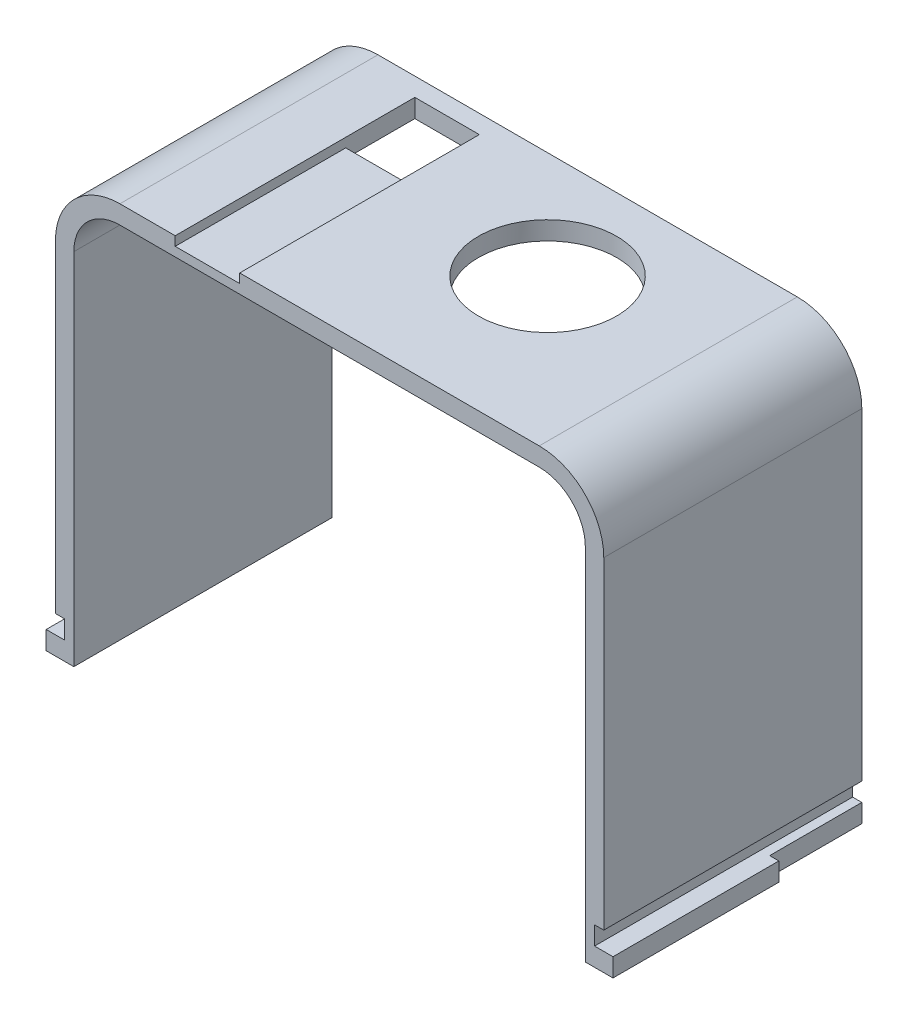
ISO-10303-21;
HEADER;
FILE_DESCRIPTION(('STEP AP214'),'2;1');
FILE_NAME('part.step','',(''),(''),'','','');
FILE_SCHEMA(('AUTOMOTIVE_DESIGN { 1 0 10303 214 1 1 1 1 }'));
ENDSEC;
DATA;
#1=APPLICATION_CONTEXT('core data for automotive mechanical design processes');
#2=APPLICATION_PROTOCOL_DEFINITION('international standard','automotive_design',2000,#1);
#3=PRODUCT_CONTEXT('',#1,'mechanical');
#4=PRODUCT('Part','Part','',(#3));
#5=PRODUCT_RELATED_PRODUCT_CATEGORY('part','',(#4));
#6=PRODUCT_DEFINITION_FORMATION('','',#4);
#7=PRODUCT_DEFINITION_CONTEXT('part definition',#1,'design');
#8=PRODUCT_DEFINITION('design','',#6,#7);
#9=PRODUCT_DEFINITION_SHAPE('','',#8);
#10=(LENGTH_UNIT() NAMED_UNIT(*) SI_UNIT(.MILLI.,.METRE.));
#11=(NAMED_UNIT(*) PLANE_ANGLE_UNIT() SI_UNIT($,.RADIAN.));
#12=(NAMED_UNIT(*) SI_UNIT($,.STERADIAN.) SOLID_ANGLE_UNIT());
#13=UNCERTAINTY_MEASURE_WITH_UNIT(LENGTH_MEASURE(1.E-05),#10,'distance_accuracy_value','');
#14=(GEOMETRIC_REPRESENTATION_CONTEXT(3) GLOBAL_UNCERTAINTY_ASSIGNED_CONTEXT((#13)) GLOBAL_UNIT_ASSIGNED_CONTEXT((#10,
#11,#12)) REPRESENTATION_CONTEXT('',''));
#15=CARTESIAN_POINT('',(0.,0.,0.));
#16=DIRECTION('',(0.,0.,1.));
#17=DIRECTION('',(1.,0.,0.));
#18=AXIS2_PLACEMENT_3D('',#15,#16,#17);
#19=CARTESIAN_POINT('',(-19.5890410958904,38.,9.5));
#20=DIRECTION('',(0.,0.,1.));
#21=DIRECTION('',(1.,0.,0.));
#22=AXIS2_PLACEMENT_3D('',#19,#20,#21);
#23=PLANE('',#22);
#24=DIRECTION('',(-1.,0.,0.));
#25=VECTOR('',#24,1.);
#26=CARTESIAN_POINT('',(-19.5890410958904,39.,9.5));
#27=LINE('',#26,#25);
#28=CARTESIAN_POINT('',(-12.5890410958904,39.,9.5));
#29=VERTEX_POINT('',#28);
#30=CARTESIAN_POINT('',(-19.5890410958904,39.,9.5));
#31=VERTEX_POINT('',#30);
#32=EDGE_CURVE('E228',#29,#31,#27,.T.);
#33=ORIENTED_EDGE('',*,*,#32,.F.);
#34=DIRECTION('',(0.,1.,0.));
#35=VECTOR('',#34,1.);
#36=CARTESIAN_POINT('',(-12.5890410958904,38.,9.5));
#37=LINE('',#36,#35);
#38=CARTESIAN_POINT('',(-12.5890410958904,38.,9.5));
#39=VERTEX_POINT('',#38);
#40=EDGE_CURVE('E266',#39,#29,#37,.T.);
#41=ORIENTED_EDGE('',*,*,#40,.F.);
#42=DIRECTION('',(1.,0.,0.));
#43=VECTOR('',#42,1.);
#44=CARTESIAN_POINT('',(-19.5890410958904,38.,9.5));
#45=LINE('',#44,#43);
#46=CARTESIAN_POINT('',(-19.5890410958904,38.,9.5));
#47=VERTEX_POINT('',#46);
#48=EDGE_CURVE('E246',#47,#39,#45,.T.);
#49=ORIENTED_EDGE('',*,*,#48,.F.);
#50=DIRECTION('',(0.,1.,0.));
#51=VECTOR('',#50,1.);
#52=CARTESIAN_POINT('',(-19.5890410958904,38.,9.5));
#53=LINE('',#52,#51);
#54=EDGE_CURVE('E254',#47,#31,#53,.T.);
#55=ORIENTED_EDGE('',*,*,#54,.T.);
#56=EDGE_LOOP('',(#33,#41,#49,#55));
#57=FACE_BOUND('',#56,.T.);
#58=ADVANCED_FACE('F32',(#57),#23,.F.);
#59=CARTESIAN_POINT('',(-30.5890410958904,0.,28.));
#60=DIRECTION('',(-1.,0.,0.));
#61=DIRECTION('',(0.,0.,1.));
#62=AXIS2_PLACEMENT_3D('',#59,#60,#61);
#63=PLANE('',#62);
#64=DIRECTION('',(0.,1.,0.));
#65=VECTOR('',#64,1.);
#66=CARTESIAN_POINT('',(-30.5890410958904,0.,0.));
#67=LINE('',#66,#65);
#68=CARTESIAN_POINT('',(-30.5890410958904,-6.00000000000001,0.));
#69=VERTEX_POINT('',#68);
#70=CARTESIAN_POINT('',(-30.5890410958904,33.,0.));
#71=VERTEX_POINT('',#70);
#72=EDGE_CURVE('E356',#69,#71,#67,.T.);
#73=ORIENTED_EDGE('',*,*,#72,.T.);
#74=DIRECTION('',(0.,0.,-1.));
#75=VECTOR('',#74,1.);
#76=CARTESIAN_POINT('',(-30.5890410958904,33.,28.));
#77=LINE('',#76,#75);
#78=CARTESIAN_POINT('',(-30.5890410958904,33.,28.));
#79=VERTEX_POINT('',#78);
#80=EDGE_CURVE('E11',#79,#71,#77,.T.);
#81=ORIENTED_EDGE('',*,*,#80,.F.);
#82=DIRECTION('',(0.,1.,0.));
#83=VECTOR('',#82,1.);
#84=CARTESIAN_POINT('',(-30.5890410958904,0.,28.));
#85=LINE('',#84,#83);
#86=CARTESIAN_POINT('',(-30.5890410958904,-6.00000000000001,28.));
#87=VERTEX_POINT('',#86);
#88=EDGE_CURVE('E358',#87,#79,#85,.T.);
#89=ORIENTED_EDGE('',*,*,#88,.F.);
#90=DIRECTION('',(0.,0.,-1.));
#91=VECTOR('',#90,1.);
#92=CARTESIAN_POINT('',(-30.5890410958904,-6.00000000000001,28.));
#93=LINE('',#92,#91);
#94=EDGE_CURVE('E386',#87,#69,#93,.T.);
#95=ORIENTED_EDGE('',*,*,#94,.T.);
#96=EDGE_LOOP('',(#73,#81,#89,#95));
#97=FACE_BOUND('',#96,.T.);
#98=ADVANCED_FACE('F34',(#97),#63,.F.);
#99=CARTESIAN_POINT('',(-25.5890410958904,33.,28.));
#100=DIRECTION('',(0.,0.,-1.));
#101=DIRECTION('',(-1.,0.,0.));
#102=AXIS2_PLACEMENT_3D('',#99,#100,#101);
#103=CYLINDRICAL_SURFACE('',#102,5.);
#104=CARTESIAN_POINT('',(-25.5890410958904,33.,0.));
#105=DIRECTION('',(0.,0.,-1.));
#106=DIRECTION('',(-1.,0.,0.));
#107=AXIS2_PLACEMENT_3D('',#104,#105,#106);
#108=CIRCLE('',#107,5.);
#109=CARTESIAN_POINT('',(-25.5890410958904,38.,0.));
#110=VERTEX_POINT('',#109);
#111=EDGE_CURVE('E388',#71,#110,#108,.T.);
#112=ORIENTED_EDGE('',*,*,#111,.T.);
#113=DIRECTION('',(0.,0.,-1.));
#114=VECTOR('',#113,1.);
#115=CARTESIAN_POINT('',(-25.5890410958904,38.,28.));
#116=LINE('',#115,#114);
#117=CARTESIAN_POINT('',(-25.5890410958904,38.,28.));
#118=VERTEX_POINT('',#117);
#119=EDGE_CURVE('E40',#118,#110,#116,.T.);
#120=ORIENTED_EDGE('',*,*,#119,.F.);
#121=CARTESIAN_POINT('',(-25.5890410958904,33.,28.));
#122=DIRECTION('',(0.,0.,-1.));
#123=DIRECTION('',(-1.,0.,0.));
#124=AXIS2_PLACEMENT_3D('',#121,#122,#123);
#125=CIRCLE('',#124,5.);
#126=EDGE_CURVE('E360',#79,#118,#125,.T.);
#127=ORIENTED_EDGE('',*,*,#126,.F.);
#128=ORIENTED_EDGE('',*,*,#80,.T.);
#129=EDGE_LOOP('',(#112,#120,#127,#128));
#130=FACE_BOUND('',#129,.T.);
#131=ADVANCED_FACE('F463',(#130),#103,.F.);
#132=CARTESIAN_POINT('',(-25.5890410958904,38.,28.));
#133=DIRECTION('',(0.,1.,0.));
#134=DIRECTION('',(-1.,0.,0.));
#135=AXIS2_PLACEMENT_3D('',#132,#133,#134);
#136=PLANE('',#135);
#137=DIRECTION('',(-1.,0.,0.));
#138=VECTOR('',#137,1.);
#139=CARTESIAN_POINT('',(-19.5890410958904,38.,2.));
#140=LINE('',#139,#138);
#141=CARTESIAN_POINT('',(-12.5890410958904,38.,2.));
#142=VERTEX_POINT('',#141);
#143=CARTESIAN_POINT('',(-19.5890410958904,38.,2.));
#144=VERTEX_POINT('',#143);
#145=EDGE_CURVE('E251',#142,#144,#140,.T.);
#146=ORIENTED_EDGE('',*,*,#145,.T.);
#147=DIRECTION('',(0.,0.,1.));
#148=VECTOR('',#147,1.);
#149=CARTESIAN_POINT('',(-19.5890410958904,38.,9.5));
#150=LINE('',#149,#148);
#151=EDGE_CURVE('E243',#144,#47,#150,.T.);
#152=ORIENTED_EDGE('',*,*,#151,.T.);
#153=ORIENTED_EDGE('',*,*,#48,.T.);
#154=DIRECTION('',(0.,0.,-1.));
#155=VECTOR('',#154,1.);
#156=CARTESIAN_POINT('',(-12.5890410958904,38.,9.5));
#157=LINE('',#156,#155);
#158=EDGE_CURVE('E55',#39,#142,#157,.T.);
#159=ORIENTED_EDGE('',*,*,#158,.T.);
#160=EDGE_LOOP('',(#146,#152,#153,#159));
#161=FACE_BOUND('',#160,.T.);
#162=CARTESIAN_POINT('',(4.41095890410959,38.,11.6));
#163=DIRECTION('',(0.,1.,0.));
#164=DIRECTION('',(-1.,0.,0.));
#165=AXIS2_PLACEMENT_3D('',#162,#163,#164);
#166=CIRCLE('',#165,7.5);
#167=CARTESIAN_POINT('',(-3.08904109589041,38.,11.6));
#168=VERTEX_POINT('',#167);
#169=EDGE_CURVE('E288',#168,#168,#166,.T.);
#170=ORIENTED_EDGE('',*,*,#169,.T.);
#171=EDGE_LOOP('',(#170));
#172=FACE_BOUND('',#171,.T.);
#173=DIRECTION('',(1.,0.,0.));
#174=VECTOR('',#173,1.);
#175=CARTESIAN_POINT('',(-25.5890410958904,38.,0.));
#176=LINE('',#175,#174);
#177=CARTESIAN_POINT('',(19.9109589041096,38.,0.));
#178=VERTEX_POINT('',#177);
#179=EDGE_CURVE('E390',#110,#178,#176,.T.);
#180=ORIENTED_EDGE('',*,*,#179,.T.);
#181=DIRECTION('',(0.,0.,-1.));
#182=VECTOR('',#181,1.);
#183=CARTESIAN_POINT('',(19.9109589041096,38.,28.));
#184=LINE('',#183,#182);
#185=CARTESIAN_POINT('',(19.9109589041096,38.,28.));
#186=VERTEX_POINT('',#185);
#187=EDGE_CURVE('E434',#186,#178,#184,.T.);
#188=ORIENTED_EDGE('',*,*,#187,.F.);
#189=DIRECTION('',(1.,0.,0.));
#190=VECTOR('',#189,1.);
#191=CARTESIAN_POINT('',(-25.5890410958904,38.,28.));
#192=LINE('',#191,#190);
#193=EDGE_CURVE('E363',#118,#186,#192,.T.);
#194=ORIENTED_EDGE('',*,*,#193,.F.);
#195=ORIENTED_EDGE('',*,*,#119,.T.);
#196=EDGE_LOOP('',(#180,#188,#194,#195));
#197=FACE_BOUND('',#196,.T.);
#198=ADVANCED_FACE('F441',(#161,#172,#197),#136,.F.);
#199=CARTESIAN_POINT('',(19.9109589041096,33.,28.));
#200=DIRECTION('',(0.,0.,-1.));
#201=DIRECTION('',(-1.,0.,0.));
#202=AXIS2_PLACEMENT_3D('',#199,#200,#201);
#203=CYLINDRICAL_SURFACE('',#202,5.);
#204=CARTESIAN_POINT('',(19.9109589041096,33.,0.));
#205=DIRECTION('',(0.,0.,-1.));
#206=DIRECTION('',(-1.,0.,0.));
#207=AXIS2_PLACEMENT_3D('',#204,#205,#206);
#208=CIRCLE('',#207,5.);
#209=CARTESIAN_POINT('',(24.9109589041096,33.,0.));
#210=VERTEX_POINT('',#209);
#211=EDGE_CURVE('E392',#178,#210,#208,.T.);
#212=ORIENTED_EDGE('',*,*,#211,.T.);
#213=DIRECTION('',(0.,0.,-1.));
#214=VECTOR('',#213,1.);
#215=CARTESIAN_POINT('',(24.9109589041096,33.,28.));
#216=LINE('',#215,#214);
#217=CARTESIAN_POINT('',(24.9109589041096,33.,28.));
#218=VERTEX_POINT('',#217);
#219=EDGE_CURVE('E431',#218,#210,#216,.T.);
#220=ORIENTED_EDGE('',*,*,#219,.F.);
#221=CARTESIAN_POINT('',(19.9109589041096,33.,28.));
#222=DIRECTION('',(0.,0.,-1.));
#223=DIRECTION('',(-1.,0.,0.));
#224=AXIS2_PLACEMENT_3D('',#221,#222,#223);
#225=CIRCLE('',#224,5.);
#226=EDGE_CURVE('E365',#186,#218,#225,.T.);
#227=ORIENTED_EDGE('',*,*,#226,.F.);
#228=ORIENTED_EDGE('',*,*,#187,.T.);
#229=EDGE_LOOP('',(#212,#220,#227,#228));
#230=FACE_BOUND('',#229,.T.);
#231=ADVANCED_FACE('F453',(#230),#203,.F.);
#232=CARTESIAN_POINT('',(24.9109589041096,0.,28.));
#233=DIRECTION('',(1.,0.,0.));
#234=DIRECTION('',(0.,0.,-1.));
#235=AXIS2_PLACEMENT_3D('',#232,#233,#234);
#236=PLANE('',#235);
#237=DIRECTION('',(0.,-1.,0.));
#238=VECTOR('',#237,1.);
#239=CARTESIAN_POINT('',(24.9109589041096,0.,0.));
#240=LINE('',#239,#238);
#241=CARTESIAN_POINT('',(24.9109589041096,-6.00000000000001,0.));
#242=VERTEX_POINT('',#241);
#243=EDGE_CURVE('E395',#210,#242,#240,.T.);
#244=ORIENTED_EDGE('',*,*,#243,.T.);
#245=DIRECTION('',(0.,0.,-1.));
#246=VECTOR('',#245,1.);
#247=CARTESIAN_POINT('',(24.9109589041096,-6.00000000000001,28.));
#248=LINE('',#247,#246);
#249=CARTESIAN_POINT('',(24.9109589041096,-6.00000000000001,28.));
#250=VERTEX_POINT('',#249);
#251=EDGE_CURVE('E428',#250,#242,#248,.T.);
#252=ORIENTED_EDGE('',*,*,#251,.F.);
#253=DIRECTION('',(0.,-1.,0.));
#254=VECTOR('',#253,1.);
#255=CARTESIAN_POINT('',(24.9109589041096,33.,28.));
#256=LINE('',#255,#254);
#257=EDGE_CURVE('E367',#218,#250,#256,.T.);
#258=ORIENTED_EDGE('',*,*,#257,.F.);
#259=ORIENTED_EDGE('',*,*,#219,.T.);
#260=EDGE_LOOP('',(#244,#252,#258,#259));
#261=FACE_BOUND('',#260,.T.);
#262=ADVANCED_FACE('F457',(#261),#236,.F.);
#263=CARTESIAN_POINT('',(24.9109589041096,-6.00000000000001,28.));
#264=DIRECTION('',(0.,1.,0.));
#265=DIRECTION('',(0.,0.,1.));
#266=AXIS2_PLACEMENT_3D('',#263,#264,#265);
#267=PLANE('',#266);
#268=DIRECTION('',(1.,0.,0.));
#269=VECTOR('',#268,1.);
#270=CARTESIAN_POINT('',(24.9109589041096,-6.00000000000001,0.));
#271=LINE('',#270,#269);
#272=CARTESIAN_POINT('',(26.9109589041096,-6.00000000000001,0.));
#273=VERTEX_POINT('',#272);
#274=EDGE_CURVE('E397',#242,#273,#271,.T.);
#275=ORIENTED_EDGE('',*,*,#274,.T.);
#276=DIRECTION('',(0.,0.,-1.));
#277=VECTOR('',#276,1.);
#278=CARTESIAN_POINT('',(26.9109589041096,-6.00000000000001,10.));
#279=LINE('',#278,#277);
#280=CARTESIAN_POINT('',(26.9109589041096,-6.00000000000001,10.));
#281=VERTEX_POINT('',#280);
#282=EDGE_CURVE('E281',#281,#273,#279,.T.);
#283=ORIENTED_EDGE('',*,*,#282,.F.);
#284=DIRECTION('',(-1.,0.,0.));
#285=VECTOR('',#284,1.);
#286=CARTESIAN_POINT('',(26.9109589041096,-6.00000000000001,10.));
#287=LINE('',#286,#285);
#288=CARTESIAN_POINT('',(27.9109589041096,-6.00000000000001,10.));
#289=VERTEX_POINT('',#288);
#290=EDGE_CURVE('E276',#289,#281,#287,.T.);
#291=ORIENTED_EDGE('',*,*,#290,.F.);
#292=DIRECTION('',(0.,0.,1.));
#293=VECTOR('',#292,1.);
#294=CARTESIAN_POINT('',(27.9109589041096,-6.00000000000001,0.));
#295=LINE('',#294,#293);
#296=CARTESIAN_POINT('',(27.9109589041096,-6.00000000000001,28.));
#297=VERTEX_POINT('',#296);
#298=EDGE_CURVE('E332',#289,#297,#295,.T.);
#299=ORIENTED_EDGE('',*,*,#298,.T.);
#300=DIRECTION('',(1.,0.,0.));
#301=VECTOR('',#300,1.);
#302=CARTESIAN_POINT('',(24.9109589041096,-6.00000000000001,28.));
#303=LINE('',#302,#301);
#304=EDGE_CURVE('E369',#250,#297,#303,.T.);
#305=ORIENTED_EDGE('',*,*,#304,.F.);
#306=ORIENTED_EDGE('',*,*,#251,.T.);
#307=EDGE_LOOP('',(#275,#283,#291,#299,#305,#306));
#308=FACE_BOUND('',#307,.T.);
#309=ADVANCED_FACE('F524',(#308),#267,.F.);
#310=CARTESIAN_POINT('',(26.9109589041096,0.,28.));
#311=DIRECTION('',(-1.,0.,0.));
#312=DIRECTION('',(0.,-1.,0.));
#313=AXIS2_PLACEMENT_3D('',#310,#311,#312);
#314=PLANE('',#313);
#315=DIRECTION('',(0.,1.,0.));
#316=VECTOR('',#315,1.);
#317=CARTESIAN_POINT('',(26.9109589041096,0.,28.));
#318=LINE('',#317,#316);
#319=CARTESIAN_POINT('',(26.9109589041096,-2.,28.));
#320=VERTEX_POINT('',#319);
#321=CARTESIAN_POINT('',(26.9109589041096,33.,28.));
#322=VERTEX_POINT('',#321);
#323=EDGE_CURVE('E372',#320,#322,#318,.T.);
#324=ORIENTED_EDGE('',*,*,#323,.F.);
#325=DIRECTION('',(0.,0.,1.));
#326=VECTOR('',#325,1.);
#327=CARTESIAN_POINT('',(26.9109589041096,-2.,0.));
#328=LINE('',#327,#326);
#329=CARTESIAN_POINT('',(26.9109589041096,-2.,0.));
#330=VERTEX_POINT('',#329);
#331=EDGE_CURVE('E320',#330,#320,#328,.T.);
#332=ORIENTED_EDGE('',*,*,#331,.F.);
#333=DIRECTION('',(0.,1.,0.));
#334=VECTOR('',#333,1.);
#335=CARTESIAN_POINT('',(26.9109589041096,0.,0.));
#336=LINE('',#335,#334);
#337=CARTESIAN_POINT('',(26.9109589041096,33.,0.));
#338=VERTEX_POINT('',#337);
#339=EDGE_CURVE('E400',#330,#338,#336,.T.);
#340=ORIENTED_EDGE('',*,*,#339,.T.);
#341=DIRECTION('',(0.,0.,-1.));
#342=VECTOR('',#341,1.);
#343=CARTESIAN_POINT('',(26.9109589041096,33.,28.));
#344=LINE('',#343,#342);
#345=EDGE_CURVE('E425',#322,#338,#344,.T.);
#346=ORIENTED_EDGE('',*,*,#345,.F.);
#347=EDGE_LOOP('',(#324,#332,#340,#346));
#348=FACE_BOUND('',#347,.T.);
#349=ADVANCED_FACE('F505',(#348),#314,.F.);
#350=CARTESIAN_POINT('',(19.9109589041096,33.,28.));
#351=DIRECTION('',(0.,0.,-1.));
#352=DIRECTION('',(-1.,0.,0.));
#353=AXIS2_PLACEMENT_3D('',#350,#351,#352);
#354=CYLINDRICAL_SURFACE('',#353,7.);
#355=CARTESIAN_POINT('',(19.9109589041096,33.,0.));
#356=DIRECTION('',(0.,0.,1.));
#357=DIRECTION('',(1.,0.,0.));
#358=AXIS2_PLACEMENT_3D('',#355,#356,#357);
#359=CIRCLE('',#358,7.);
#360=CARTESIAN_POINT('',(19.9109589041096,40.,0.));
#361=VERTEX_POINT('',#360);
#362=EDGE_CURVE('E402',#338,#361,#359,.T.);
#363=ORIENTED_EDGE('',*,*,#362,.T.);
#364=DIRECTION('',(0.,0.,-1.));
#365=VECTOR('',#364,1.);
#366=CARTESIAN_POINT('',(19.9109589041096,40.,28.));
#367=LINE('',#366,#365);
#368=CARTESIAN_POINT('',(19.9109589041096,40.,28.));
#369=VERTEX_POINT('',#368);
#370=EDGE_CURVE('E422',#369,#361,#367,.T.);
#371=ORIENTED_EDGE('',*,*,#370,.F.);
#372=CARTESIAN_POINT('',(19.9109589041096,33.,28.));
#373=DIRECTION('',(0.,0.,1.));
#374=DIRECTION('',(1.,0.,0.));
#375=AXIS2_PLACEMENT_3D('',#372,#373,#374);
#376=CIRCLE('',#375,7.);
#377=EDGE_CURVE('E374',#322,#369,#376,.T.);
#378=ORIENTED_EDGE('',*,*,#377,.F.);
#379=ORIENTED_EDGE('',*,*,#345,.T.);
#380=EDGE_LOOP('',(#363,#371,#378,#379));
#381=FACE_BOUND('',#380,.T.);
#382=ADVANCED_FACE('F501',(#381),#354,.T.);
#383=CARTESIAN_POINT('',(19.9109589041096,40.,28.));
#384=DIRECTION('',(0.,-1.,0.));
#385=DIRECTION('',(0.,0.,-1.));
#386=AXIS2_PLACEMENT_3D('',#383,#384,#385);
#387=PLANE('',#386);
#388=DIRECTION('',(-1.,0.,0.));
#389=VECTOR('',#388,1.);
#390=CARTESIAN_POINT('',(19.9109589041096,40.,28.));
#391=LINE('',#390,#389);
#392=CARTESIAN_POINT('',(-19.5890410958904,40.,28.));
#393=VERTEX_POINT('',#392);
#394=CARTESIAN_POINT('',(-25.5890410958904,40.,28.));
#395=VERTEX_POINT('',#394);
#396=EDGE_CURVE('E376',#393,#395,#391,.T.);
#397=ORIENTED_EDGE('',*,*,#396,.F.);
#398=DIRECTION('',(0.,0.,1.));
#399=VECTOR('',#398,1.);
#400=CARTESIAN_POINT('',(-19.5890410958904,40.,9.5));
#401=LINE('',#400,#399);
#402=CARTESIAN_POINT('',(-19.5890410958904,40.,2.));
#403=VERTEX_POINT('',#402);
#404=EDGE_CURVE('E223',#403,#393,#401,.T.);
#405=ORIENTED_EDGE('',*,*,#404,.F.);
#406=DIRECTION('',(-1.,0.,0.));
#407=VECTOR('',#406,1.);
#408=CARTESIAN_POINT('',(-19.5890410958904,40.,2.));
#409=LINE('',#408,#407);
#410=CARTESIAN_POINT('',(-12.5890410958904,40.,2.));
#411=VERTEX_POINT('',#410);
#412=EDGE_CURVE('E247',#411,#403,#409,.T.);
#413=ORIENTED_EDGE('',*,*,#412,.F.);
#414=DIRECTION('',(0.,0.,-1.));
#415=VECTOR('',#414,1.);
#416=CARTESIAN_POINT('',(-12.5890410958904,40.,9.5));
#417=LINE('',#416,#415);
#418=CARTESIAN_POINT('',(-12.5890410958904,40.,28.));
#419=VERTEX_POINT('',#418);
#420=EDGE_CURVE('E256',#419,#411,#417,.T.);
#421=ORIENTED_EDGE('',*,*,#420,.F.);
#422=EDGE_CURVE('E377',#369,#419,#391,.T.);
#423=ORIENTED_EDGE('',*,*,#422,.F.);
#424=ORIENTED_EDGE('',*,*,#370,.T.);
#425=DIRECTION('',(-1.,0.,0.));
#426=VECTOR('',#425,1.);
#427=CARTESIAN_POINT('',(19.9109589041096,40.,0.));
#428=LINE('',#427,#426);
#429=CARTESIAN_POINT('',(-25.5890410958904,40.,0.));
#430=VERTEX_POINT('',#429);
#431=EDGE_CURVE('E404',#361,#430,#428,.T.);
#432=ORIENTED_EDGE('',*,*,#431,.T.);
#433=DIRECTION('',(0.,0.,-1.));
#434=VECTOR('',#433,1.);
#435=CARTESIAN_POINT('',(-25.5890410958904,40.,28.));
#436=LINE('',#435,#434);
#437=EDGE_CURVE('E419',#395,#430,#436,.T.);
#438=ORIENTED_EDGE('',*,*,#437,.F.);
#439=EDGE_LOOP('',(#397,#405,#413,#421,#423,#424,#432,#438));
#440=FACE_BOUND('',#439,.T.);
#441=CARTESIAN_POINT('',(4.41095890410959,40.,11.6));
#442=DIRECTION('',(0.,1.,0.));
#443=DIRECTION('',(0.,0.,1.));
#444=AXIS2_PLACEMENT_3D('',#441,#442,#443);
#445=CIRCLE('',#444,7.5);
#446=CARTESIAN_POINT('',(4.41095890410959,40.,19.1));
#447=VERTEX_POINT('',#446);
#448=EDGE_CURVE('E283',#447,#447,#445,.T.);
#449=ORIENTED_EDGE('',*,*,#448,.F.);
#450=EDGE_LOOP('',(#449));
#451=FACE_BOUND('',#450,.T.);
#452=ADVANCED_FACE('F495',(#440,#451),#387,.F.);
#453=CARTESIAN_POINT('',(-25.5890410958904,33.,28.));
#454=DIRECTION('',(0.,0.,-1.));
#455=DIRECTION('',(-1.,0.,0.));
#456=AXIS2_PLACEMENT_3D('',#453,#454,#455);
#457=CYLINDRICAL_SURFACE('',#456,7.);
#458=CARTESIAN_POINT('',(-25.5890410958904,33.,0.));
#459=DIRECTION('',(0.,0.,1.));
#460=DIRECTION('',(1.,0.,0.));
#461=AXIS2_PLACEMENT_3D('',#458,#459,#460);
#462=CIRCLE('',#461,7.);
#463=CARTESIAN_POINT('',(-32.5890410958904,32.9999999999999,0.));
#464=VERTEX_POINT('',#463);
#465=EDGE_CURVE('E406',#430,#464,#462,.T.);
#466=ORIENTED_EDGE('',*,*,#465,.T.);
#467=DIRECTION('',(0.,0.,-1.));
#468=VECTOR('',#467,1.);
#469=CARTESIAN_POINT('',(-32.5890410958904,32.9999999999999,28.));
#470=LINE('',#469,#468);
#471=CARTESIAN_POINT('',(-32.5890410958904,32.9999999999999,28.));
#472=VERTEX_POINT('',#471);
#473=EDGE_CURVE('E416',#472,#464,#470,.T.);
#474=ORIENTED_EDGE('',*,*,#473,.F.);
#475=CARTESIAN_POINT('',(-25.5890410958904,33.,28.));
#476=DIRECTION('',(0.,0.,1.));
#477=DIRECTION('',(1.,0.,0.));
#478=AXIS2_PLACEMENT_3D('',#475,#476,#477);
#479=CIRCLE('',#478,7.);
#480=EDGE_CURVE('E379',#395,#472,#479,.T.);
#481=ORIENTED_EDGE('',*,*,#480,.F.);
#482=ORIENTED_EDGE('',*,*,#437,.T.);
#483=EDGE_LOOP('',(#466,#474,#481,#482));
#484=FACE_BOUND('',#483,.T.);
#485=ADVANCED_FACE('F489',(#484),#457,.T.);
#486=CARTESIAN_POINT('',(-32.5890410958904,0.,28.));
#487=DIRECTION('',(1.,0.,0.));
#488=DIRECTION('',(0.,0.,-1.));
#489=AXIS2_PLACEMENT_3D('',#486,#487,#488);
#490=PLANE('',#489);
#491=DIRECTION('',(0.,-1.,0.));
#492=VECTOR('',#491,1.);
#493=CARTESIAN_POINT('',(-32.5890410958904,0.,0.));
#494=LINE('',#493,#492);
#495=CARTESIAN_POINT('',(-32.5890410958904,-2.,0.));
#496=VERTEX_POINT('',#495);
#497=EDGE_CURVE('E409',#464,#496,#494,.T.);
#498=ORIENTED_EDGE('',*,*,#497,.T.);
#499=DIRECTION('',(0.,0.,1.));
#500=VECTOR('',#499,1.);
#501=CARTESIAN_POINT('',(-32.5890410958904,-2.,0.));
#502=LINE('',#501,#500);
#503=CARTESIAN_POINT('',(-32.5890410958904,-2.,28.));
#504=VERTEX_POINT('',#503);
#505=EDGE_CURVE('E305',#496,#504,#502,.T.);
#506=ORIENTED_EDGE('',*,*,#505,.T.);
#507=DIRECTION('',(0.,-1.,0.));
#508=VECTOR('',#507,1.);
#509=CARTESIAN_POINT('',(-32.5890410958904,32.9999999999999,28.));
#510=LINE('',#509,#508);
#511=EDGE_CURVE('E381',#472,#504,#510,.T.);
#512=ORIENTED_EDGE('',*,*,#511,.F.);
#513=ORIENTED_EDGE('',*,*,#473,.T.);
#514=EDGE_LOOP('',(#498,#506,#512,#513));
#515=FACE_BOUND('',#514,.T.);
#516=ADVANCED_FACE('F484',(#515),#490,.F.);
#517=CARTESIAN_POINT('',(-32.5890410958904,-6.00000000000001,28.));
#518=DIRECTION('',(0.,1.,0.));
#519=DIRECTION('',(0.,0.,1.));
#520=AXIS2_PLACEMENT_3D('',#517,#518,#519);
#521=PLANE('',#520);
#522=DIRECTION('',(1.,0.,0.));
#523=VECTOR('',#522,1.);
#524=CARTESIAN_POINT('',(-32.5890410958904,-6.00000000000001,0.));
#525=LINE('',#524,#523);
#526=CARTESIAN_POINT('',(-33.5890410958904,-6.,0.));
#527=VERTEX_POINT('',#526);
#528=EDGE_CURVE('E361',#527,#69,#525,.T.);
#529=ORIENTED_EDGE('',*,*,#528,.T.);
#530=ORIENTED_EDGE('',*,*,#94,.F.);
#531=DIRECTION('',(1.,0.,0.));
#532=VECTOR('',#531,1.);
#533=CARTESIAN_POINT('',(-32.5890410958904,-6.00000000000001,28.));
#534=LINE('',#533,#532);
#535=CARTESIAN_POINT('',(-33.5890410958904,-6.,28.));
#536=VERTEX_POINT('',#535);
#537=EDGE_CURVE('E384',#536,#87,#534,.T.);
#538=ORIENTED_EDGE('',*,*,#537,.F.);
#539=DIRECTION('',(0.,0.,1.));
#540=VECTOR('',#539,1.);
#541=CARTESIAN_POINT('',(-33.5890410958904,-6.,0.));
#542=LINE('',#541,#540);
#543=EDGE_CURVE('E353',#527,#536,#542,.T.);
#544=ORIENTED_EDGE('',*,*,#543,.F.);
#545=EDGE_LOOP('',(#529,#530,#538,#544));
#546=FACE_BOUND('',#545,.T.);
#547=ADVANCED_FACE('F469',(#546),#521,.F.);
#548=CARTESIAN_POINT('',(-25.5890410958904,33.,28.));
#549=DIRECTION('',(0.,0.,1.));
#550=DIRECTION('',(1.,0.,0.));
#551=AXIS2_PLACEMENT_3D('',#548,#549,#550);
#552=PLANE('',#551);
#553=DIRECTION('',(0.,1.,0.));
#554=VECTOR('',#553,1.);
#555=CARTESIAN_POINT('',(-19.5890410958904,39.,28.));
#556=LINE('',#555,#554);
#557=CARTESIAN_POINT('',(-19.5890410958904,39.,28.));
#558=VERTEX_POINT('',#557);
#559=EDGE_CURVE('E218',#558,#393,#556,.T.);
#560=ORIENTED_EDGE('',*,*,#559,.T.);
#561=ORIENTED_EDGE('',*,*,#396,.T.);
#562=ORIENTED_EDGE('',*,*,#480,.T.);
#563=ORIENTED_EDGE('',*,*,#511,.T.);
#564=DIRECTION('',(-1.,0.,0.));
#565=VECTOR('',#564,1.);
#566=CARTESIAN_POINT('',(-32.5890410958904,-2.,28.));
#567=LINE('',#566,#565);
#568=CARTESIAN_POINT('',(-31.5890410958904,-2.,28.));
#569=VERTEX_POINT('',#568);
#570=EDGE_CURVE('E296',#569,#504,#567,.T.);
#571=ORIENTED_EDGE('',*,*,#570,.F.);
#572=DIRECTION('',(0.,1.,0.));
#573=VECTOR('',#572,1.);
#574=CARTESIAN_POINT('',(-31.5890410958904,-4.,28.));
#575=LINE('',#574,#573);
#576=CARTESIAN_POINT('',(-31.5890410958904,-4.,28.));
#577=VERTEX_POINT('',#576);
#578=EDGE_CURVE('E300',#577,#569,#575,.T.);
#579=ORIENTED_EDGE('',*,*,#578,.F.);
#580=DIRECTION('',(-1.,0.,0.));
#581=VECTOR('',#580,1.);
#582=CARTESIAN_POINT('',(-32.5890410958904,-4.,28.));
#583=LINE('',#582,#581);
#584=CARTESIAN_POINT('',(-33.5890410958904,-4.,28.));
#585=VERTEX_POINT('',#584);
#586=EDGE_CURVE('E339',#577,#585,#583,.T.);
#587=ORIENTED_EDGE('',*,*,#586,.T.);
#588=DIRECTION('',(0.,-1.,0.));
#589=VECTOR('',#588,1.);
#590=CARTESIAN_POINT('',(-33.5890410958904,-6.,28.));
#591=LINE('',#590,#589);
#592=EDGE_CURVE('E345',#585,#536,#591,.T.);
#593=ORIENTED_EDGE('',*,*,#592,.T.);
#594=ORIENTED_EDGE('',*,*,#537,.T.);
#595=ORIENTED_EDGE('',*,*,#88,.T.);
#596=ORIENTED_EDGE('',*,*,#126,.T.);
#597=ORIENTED_EDGE('',*,*,#193,.T.);
#598=ORIENTED_EDGE('',*,*,#226,.T.);
#599=ORIENTED_EDGE('',*,*,#257,.T.);
#600=ORIENTED_EDGE('',*,*,#304,.T.);
#601=DIRECTION('',(0.,1.,0.));
#602=VECTOR('',#601,1.);
#603=CARTESIAN_POINT('',(27.9109589041096,-6.00000000000001,28.));
#604=LINE('',#603,#602);
#605=CARTESIAN_POINT('',(27.9109589041096,-4.,28.));
#606=VERTEX_POINT('',#605);
#607=EDGE_CURVE('E308',#297,#606,#604,.T.);
#608=ORIENTED_EDGE('',*,*,#607,.T.);
#609=DIRECTION('',(-1.,0.,0.));
#610=VECTOR('',#609,1.);
#611=CARTESIAN_POINT('',(26.9109589041096,-4.,28.));
#612=LINE('',#611,#610);
#613=CARTESIAN_POINT('',(25.9109589041096,-4.,28.));
#614=VERTEX_POINT('',#613);
#615=EDGE_CURVE('E333',#606,#614,#612,.T.);
#616=ORIENTED_EDGE('',*,*,#615,.T.);
#617=DIRECTION('',(0.,-1.,0.));
#618=VECTOR('',#617,1.);
#619=CARTESIAN_POINT('',(25.9109589041096,-4.,28.));
#620=LINE('',#619,#618);
#621=CARTESIAN_POINT('',(25.9109589041096,-2.,28.));
#622=VERTEX_POINT('',#621);
#623=EDGE_CURVE('E317',#622,#614,#620,.T.);
#624=ORIENTED_EDGE('',*,*,#623,.F.);
#625=DIRECTION('',(-1.,0.,0.));
#626=VECTOR('',#625,1.);
#627=CARTESIAN_POINT('',(26.9109589041096,-2.,28.));
#628=LINE('',#627,#626);
#629=EDGE_CURVE('E291',#320,#622,#628,.T.);
#630=ORIENTED_EDGE('',*,*,#629,.F.);
#631=ORIENTED_EDGE('',*,*,#323,.T.);
#632=ORIENTED_EDGE('',*,*,#377,.T.);
#633=ORIENTED_EDGE('',*,*,#422,.T.);
#634=DIRECTION('',(0.,1.,0.));
#635=VECTOR('',#634,1.);
#636=CARTESIAN_POINT('',(-12.5890410958904,39.,28.));
#637=LINE('',#636,#635);
#638=CARTESIAN_POINT('',(-12.5890410958904,39.,28.));
#639=VERTEX_POINT('',#638);
#640=EDGE_CURVE('E227',#639,#419,#637,.T.);
#641=ORIENTED_EDGE('',*,*,#640,.F.);
#642=DIRECTION('',(1.,0.,0.));
#643=VECTOR('',#642,1.);
#644=CARTESIAN_POINT('',(-19.5890410958904,39.,28.));
#645=LINE('',#644,#643);
#646=EDGE_CURVE('E231',#558,#639,#645,.T.);
#647=ORIENTED_EDGE('',*,*,#646,.F.);
#648=EDGE_LOOP('',(#560,#561,#562,#563,#571,#579,#587,#593,#594,#595,#596,#597,#598,#599,#600,
#608,#616,#624,#630,#631,#632,#633,#641,#647));
#649=FACE_BOUND('',#648,.T.);
#650=ADVANCED_FACE('F235',(#649),#552,.T.);
#651=CARTESIAN_POINT('',(-25.5890410958904,33.,0.));
#652=DIRECTION('',(0.,0.,1.));
#653=DIRECTION('',(1.,0.,0.));
#654=AXIS2_PLACEMENT_3D('',#651,#652,#653);
#655=PLANE('',#654);
#656=DIRECTION('',(-1.,0.,0.));
#657=VECTOR('',#656,1.);
#658=CARTESIAN_POINT('',(26.9109589041096,-4.,0.));
#659=LINE('',#658,#657);
#660=CARTESIAN_POINT('',(26.9109589041096,-4.,0.));
#661=VERTEX_POINT('',#660);
#662=CARTESIAN_POINT('',(25.9109589041096,-4.,0.));
#663=VERTEX_POINT('',#662);
#664=EDGE_CURVE('E330',#661,#663,#659,.T.);
#665=ORIENTED_EDGE('',*,*,#664,.F.);
#666=DIRECTION('',(0.,1.,0.));
#667=VECTOR('',#666,1.);
#668=CARTESIAN_POINT('',(26.9109589041096,-4.,0.));
#669=LINE('',#668,#667);
#670=EDGE_CURVE('E263',#273,#661,#669,.T.);
#671=ORIENTED_EDGE('',*,*,#670,.F.);
#672=ORIENTED_EDGE('',*,*,#274,.F.);
#673=ORIENTED_EDGE('',*,*,#243,.F.);
#674=ORIENTED_EDGE('',*,*,#211,.F.);
#675=ORIENTED_EDGE('',*,*,#179,.F.);
#676=ORIENTED_EDGE('',*,*,#111,.F.);
#677=ORIENTED_EDGE('',*,*,#72,.F.);
#678=ORIENTED_EDGE('',*,*,#528,.F.);
#679=DIRECTION('',(0.,-1.,0.));
#680=VECTOR('',#679,1.);
#681=CARTESIAN_POINT('',(-33.5890410958904,-6.,0.));
#682=LINE('',#681,#680);
#683=CARTESIAN_POINT('',(-33.5890410958904,-4.,0.));
#684=VERTEX_POINT('',#683);
#685=EDGE_CURVE('E344',#684,#527,#682,.T.);
#686=ORIENTED_EDGE('',*,*,#685,.F.);
#687=DIRECTION('',(-1.,0.,0.));
#688=VECTOR('',#687,1.);
#689=CARTESIAN_POINT('',(-32.5890410958904,-4.,0.));
#690=LINE('',#689,#688);
#691=CARTESIAN_POINT('',(-31.5890410958904,-4.,0.));
#692=VERTEX_POINT('',#691);
#693=EDGE_CURVE('E341',#692,#684,#690,.T.);
#694=ORIENTED_EDGE('',*,*,#693,.F.);
#695=DIRECTION('',(0.,1.,0.));
#696=VECTOR('',#695,1.);
#697=CARTESIAN_POINT('',(-31.5890410958904,-4.,0.));
#698=LINE('',#697,#696);
#699=CARTESIAN_POINT('',(-31.5890410958904,-2.,0.));
#700=VERTEX_POINT('',#699);
#701=EDGE_CURVE('E292',#692,#700,#698,.T.);
#702=ORIENTED_EDGE('',*,*,#701,.T.);
#703=DIRECTION('',(-1.,0.,0.));
#704=VECTOR('',#703,1.);
#705=CARTESIAN_POINT('',(-32.5890410958904,-2.,0.));
#706=LINE('',#705,#704);
#707=EDGE_CURVE('E295',#700,#496,#706,.T.);
#708=ORIENTED_EDGE('',*,*,#707,.T.);
#709=ORIENTED_EDGE('',*,*,#497,.F.);
#710=ORIENTED_EDGE('',*,*,#465,.F.);
#711=ORIENTED_EDGE('',*,*,#431,.F.);
#712=ORIENTED_EDGE('',*,*,#362,.F.);
#713=ORIENTED_EDGE('',*,*,#339,.F.);
#714=DIRECTION('',(-1.,0.,0.));
#715=VECTOR('',#714,1.);
#716=CARTESIAN_POINT('',(26.9109589041096,-2.,0.));
#717=LINE('',#716,#715);
#718=CARTESIAN_POINT('',(25.9109589041096,-2.,0.));
#719=VERTEX_POINT('',#718);
#720=EDGE_CURVE('E313',#330,#719,#717,.T.);
#721=ORIENTED_EDGE('',*,*,#720,.T.);
#722=DIRECTION('',(0.,-1.,0.));
#723=VECTOR('',#722,1.);
#724=CARTESIAN_POINT('',(25.9109589041096,-4.,0.));
#725=LINE('',#724,#723);
#726=EDGE_CURVE('E316',#719,#663,#725,.T.);
#727=ORIENTED_EDGE('',*,*,#726,.T.);
#728=EDGE_LOOP('',(#665,#671,#672,#673,#674,#675,#676,#677,#678,#686,#694,#702,#708,#709,#710,
#711,#712,#713,#721,#727));
#729=FACE_BOUND('',#728,.T.);
#730=ADVANCED_FACE('F449',(#729),#655,.F.);
#731=CARTESIAN_POINT('',(-33.5890410958904,-6.,0.));
#732=DIRECTION('',(-1.,0.,0.));
#733=DIRECTION('',(0.,0.,1.));
#734=AXIS2_PLACEMENT_3D('',#731,#732,#733);
#735=PLANE('',#734);
#736=ORIENTED_EDGE('',*,*,#592,.F.);
#737=DIRECTION('',(0.,0.,1.));
#738=VECTOR('',#737,1.);
#739=CARTESIAN_POINT('',(-33.5890410958904,-4.,0.));
#740=LINE('',#739,#738);
#741=EDGE_CURVE('E348',#684,#585,#740,.T.);
#742=ORIENTED_EDGE('',*,*,#741,.F.);
#743=ORIENTED_EDGE('',*,*,#685,.T.);
#744=ORIENTED_EDGE('',*,*,#543,.T.);
#745=EDGE_LOOP('',(#736,#742,#743,#744));
#746=FACE_BOUND('',#745,.T.);
#747=ADVANCED_FACE('F472',(#746),#735,.T.);
#748=CARTESIAN_POINT('',(-32.5890410958904,-4.,0.));
#749=DIRECTION('',(0.,1.,0.));
#750=DIRECTION('',(0.,0.,1.));
#751=AXIS2_PLACEMENT_3D('',#748,#749,#750);
#752=PLANE('',#751);
#753=ORIENTED_EDGE('',*,*,#586,.F.);
#754=DIRECTION('',(0.,0.,1.));
#755=VECTOR('',#754,1.);
#756=CARTESIAN_POINT('',(-31.5890410958904,-4.,0.));
#757=LINE('',#756,#755);
#758=EDGE_CURVE('E299',#692,#577,#757,.T.);
#759=ORIENTED_EDGE('',*,*,#758,.F.);
#760=ORIENTED_EDGE('',*,*,#693,.T.);
#761=ORIENTED_EDGE('',*,*,#741,.T.);
#762=EDGE_LOOP('',(#753,#759,#760,#761));
#763=FACE_BOUND('',#762,.T.);
#764=ADVANCED_FACE('F475',(#763),#752,.T.);
#765=CARTESIAN_POINT('',(26.9109589041096,-4.,0.));
#766=DIRECTION('',(0.,1.,0.));
#767=DIRECTION('',(0.,0.,1.));
#768=AXIS2_PLACEMENT_3D('',#765,#766,#767);
#769=PLANE('',#768);
#770=DIRECTION('',(0.,0.,-1.));
#771=VECTOR('',#770,1.);
#772=CARTESIAN_POINT('',(26.9109589041096,-4.,10.));
#773=LINE('',#772,#771);
#774=CARTESIAN_POINT('',(26.9109589041096,-4.,10.));
#775=VERTEX_POINT('',#774);
#776=EDGE_CURVE('E279',#775,#661,#773,.T.);
#777=ORIENTED_EDGE('',*,*,#776,.T.);
#778=ORIENTED_EDGE('',*,*,#664,.T.);
#779=DIRECTION('',(0.,0.,1.));
#780=VECTOR('',#779,1.);
#781=CARTESIAN_POINT('',(25.9109589041096,-4.,0.));
#782=LINE('',#781,#780);
#783=EDGE_CURVE('E303',#663,#614,#782,.T.);
#784=ORIENTED_EDGE('',*,*,#783,.T.);
#785=ORIENTED_EDGE('',*,*,#615,.F.);
#786=DIRECTION('',(0.,0.,1.));
#787=VECTOR('',#786,1.);
#788=CARTESIAN_POINT('',(27.9109589041096,-4.,0.));
#789=LINE('',#788,#787);
#790=CARTESIAN_POINT('',(27.9109589041096,-4.,10.));
#791=VERTEX_POINT('',#790);
#792=EDGE_CURVE('E337',#791,#606,#789,.T.);
#793=ORIENTED_EDGE('',*,*,#792,.F.);
#794=DIRECTION('',(1.,0.,0.));
#795=VECTOR('',#794,1.);
#796=CARTESIAN_POINT('',(26.9109589041096,-4.,10.));
#797=LINE('',#796,#795);
#798=EDGE_CURVE('E272',#775,#791,#797,.T.);
#799=ORIENTED_EDGE('',*,*,#798,.F.);
#800=EDGE_LOOP('',(#777,#778,#784,#785,#793,#799));
#801=FACE_BOUND('',#800,.T.);
#802=ADVANCED_FACE('F517',(#801),#769,.T.);
#803=CARTESIAN_POINT('',(27.9109589041096,-6.00000000000001,0.));
#804=DIRECTION('',(1.,0.,0.));
#805=DIRECTION('',(0.,0.,-1.));
#806=AXIS2_PLACEMENT_3D('',#803,#804,#805);
#807=PLANE('',#806);
#808=DIRECTION('',(0.,-1.,0.));
#809=VECTOR('',#808,1.);
#810=CARTESIAN_POINT('',(27.9109589041096,-4.,10.));
#811=LINE('',#810,#809);
#812=EDGE_CURVE('E274',#791,#289,#811,.T.);
#813=ORIENTED_EDGE('',*,*,#812,.F.);
#814=ORIENTED_EDGE('',*,*,#792,.T.);
#815=ORIENTED_EDGE('',*,*,#607,.F.);
#816=ORIENTED_EDGE('',*,*,#298,.F.);
#817=EDGE_LOOP('',(#813,#814,#815,#816));
#818=FACE_BOUND('',#817,.T.);
#819=ADVANCED_FACE('F529',(#818),#807,.T.);
#820=CARTESIAN_POINT('',(25.9109589041096,-4.,0.));
#821=DIRECTION('',(-1.,0.,0.));
#822=DIRECTION('',(0.,0.,1.));
#823=AXIS2_PLACEMENT_3D('',#820,#821,#822);
#824=PLANE('',#823);
#825=ORIENTED_EDGE('',*,*,#623,.T.);
#826=ORIENTED_EDGE('',*,*,#783,.F.);
#827=ORIENTED_EDGE('',*,*,#726,.F.);
#828=DIRECTION('',(0.,0.,1.));
#829=VECTOR('',#828,1.);
#830=CARTESIAN_POINT('',(25.9109589041096,-2.,0.));
#831=LINE('',#830,#829);
#832=EDGE_CURVE('E327',#719,#622,#831,.T.);
#833=ORIENTED_EDGE('',*,*,#832,.T.);
#834=EDGE_LOOP('',(#825,#826,#827,#833));
#835=FACE_BOUND('',#834,.T.);
#836=ADVANCED_FACE('F514',(#835),#824,.F.);
#837=CARTESIAN_POINT('',(26.9109589041096,-2.,0.));
#838=DIRECTION('',(0.,1.,0.));
#839=DIRECTION('',(0.,0.,1.));
#840=AXIS2_PLACEMENT_3D('',#837,#838,#839);
#841=PLANE('',#840);
#842=ORIENTED_EDGE('',*,*,#629,.T.);
#843=ORIENTED_EDGE('',*,*,#832,.F.);
#844=ORIENTED_EDGE('',*,*,#720,.F.);
#845=ORIENTED_EDGE('',*,*,#331,.T.);
#846=EDGE_LOOP('',(#842,#843,#844,#845));
#847=FACE_BOUND('',#846,.T.);
#848=ADVANCED_FACE('F509',(#847),#841,.F.);
#849=CARTESIAN_POINT('',(-32.5890410958904,-2.,0.));
#850=DIRECTION('',(0.,1.,0.));
#851=DIRECTION('',(0.,0.,1.));
#852=AXIS2_PLACEMENT_3D('',#849,#850,#851);
#853=PLANE('',#852);
#854=ORIENTED_EDGE('',*,*,#570,.T.);
#855=ORIENTED_EDGE('',*,*,#505,.F.);
#856=ORIENTED_EDGE('',*,*,#707,.F.);
#857=DIRECTION('',(0.,0.,1.));
#858=VECTOR('',#857,1.);
#859=CARTESIAN_POINT('',(-31.5890410958904,-2.,0.));
#860=LINE('',#859,#858);
#861=EDGE_CURVE('E309',#700,#569,#860,.T.);
#862=ORIENTED_EDGE('',*,*,#861,.T.);
#863=EDGE_LOOP('',(#854,#855,#856,#862));
#864=FACE_BOUND('',#863,.T.);
#865=ADVANCED_FACE('F689',(#864),#853,.F.);
#866=CARTESIAN_POINT('',(-31.5890410958904,-4.,0.));
#867=DIRECTION('',(1.,0.,0.));
#868=DIRECTION('',(0.,0.,-1.));
#869=AXIS2_PLACEMENT_3D('',#866,#867,#868);
#870=PLANE('',#869);
#871=ORIENTED_EDGE('',*,*,#578,.T.);
#872=ORIENTED_EDGE('',*,*,#861,.F.);
#873=ORIENTED_EDGE('',*,*,#701,.F.);
#874=ORIENTED_EDGE('',*,*,#758,.T.);
#875=EDGE_LOOP('',(#871,#872,#873,#874));
#876=FACE_BOUND('',#875,.T.);
#877=ADVANCED_FACE('F479',(#876),#870,.F.);
#878=CARTESIAN_POINT('',(4.41095890410959,30.,11.6));
#879=DIRECTION('',(0.,1.,0.));
#880=DIRECTION('',(0.,0.,1.));
#881=AXIS2_PLACEMENT_3D('',#878,#879,#880);
#882=CYLINDRICAL_SURFACE('',#881,7.5);
#883=ORIENTED_EDGE('',*,*,#448,.T.);
#884=EDGE_LOOP('',(#883));
#885=FACE_BOUND('',#884,.T.);
#886=ORIENTED_EDGE('',*,*,#169,.F.);
#887=EDGE_LOOP('',(#886));
#888=FACE_BOUND('',#887,.T.);
#889=ADVANCED_FACE('F534',(#885,#888),#882,.F.);
#890=CARTESIAN_POINT('',(26.9109589041096,-4.,10.));
#891=DIRECTION('',(-1.,0.,0.));
#892=DIRECTION('',(0.,0.,1.));
#893=AXIS2_PLACEMENT_3D('',#890,#891,#892);
#894=PLANE('',#893);
#895=ORIENTED_EDGE('',*,*,#670,.T.);
#896=ORIENTED_EDGE('',*,*,#776,.F.);
#897=DIRECTION('',(0.,1.,0.));
#898=VECTOR('',#897,1.);
#899=CARTESIAN_POINT('',(26.9109589041096,-4.,10.));
#900=LINE('',#899,#898);
#901=EDGE_CURVE('E269',#281,#775,#900,.T.);
#902=ORIENTED_EDGE('',*,*,#901,.F.);
#903=ORIENTED_EDGE('',*,*,#282,.T.);
#904=EDGE_LOOP('',(#895,#896,#902,#903));
#905=FACE_BOUND('',#904,.T.);
#906=ADVANCED_FACE('F532',(#905),#894,.F.);
#907=CARTESIAN_POINT('',(0.,0.,10.));
#908=DIRECTION('',(0.,0.,1.));
#909=DIRECTION('',(1.,0.,0.));
#910=AXIS2_PLACEMENT_3D('',#907,#908,#909);
#911=PLANE('',#910);
#912=ORIENTED_EDGE('',*,*,#901,.T.);
#913=ORIENTED_EDGE('',*,*,#798,.T.);
#914=ORIENTED_EDGE('',*,*,#812,.T.);
#915=ORIENTED_EDGE('',*,*,#290,.T.);
#916=EDGE_LOOP('',(#912,#913,#914,#915));
#917=FACE_BOUND('',#916,.T.);
#918=ADVANCED_FACE('F531',(#917),#911,.F.);
#919=CARTESIAN_POINT('',(-19.5890410958904,38.,9.5));
#920=DIRECTION('',(-1.,0.,0.));
#921=DIRECTION('',(0.,0.,1.));
#922=AXIS2_PLACEMENT_3D('',#919,#920,#921);
#923=PLANE('',#922);
#924=ORIENTED_EDGE('',*,*,#404,.T.);
#925=ORIENTED_EDGE('',*,*,#559,.F.);
#926=DIRECTION('',(0.,0.,1.));
#927=VECTOR('',#926,1.);
#928=CARTESIAN_POINT('',(-19.5890410958904,39.,9.5));
#929=LINE('',#928,#927);
#930=EDGE_CURVE('E221',#31,#558,#929,.T.);
#931=ORIENTED_EDGE('',*,*,#930,.F.);
#932=ORIENTED_EDGE('',*,*,#54,.F.);
#933=ORIENTED_EDGE('',*,*,#151,.F.);
#934=DIRECTION('',(0.,1.,0.));
#935=VECTOR('',#934,1.);
#936=CARTESIAN_POINT('',(-19.5890410958904,38.,2.));
#937=LINE('',#936,#935);
#938=EDGE_CURVE('E261',#144,#403,#937,.T.);
#939=ORIENTED_EDGE('',*,*,#938,.T.);
#940=EDGE_LOOP('',(#924,#925,#931,#932,#933,#939));
#941=FACE_BOUND('',#940,.T.);
#942=ADVANCED_FACE('F220',(#941),#923,.F.);
#943=CARTESIAN_POINT('',(-19.5890410958904,38.,2.));
#944=DIRECTION('',(0.,0.,-1.));
#945=DIRECTION('',(-1.,0.,0.));
#946=AXIS2_PLACEMENT_3D('',#943,#944,#945);
#947=PLANE('',#946);
#948=ORIENTED_EDGE('',*,*,#412,.T.);
#949=ORIENTED_EDGE('',*,*,#938,.F.);
#950=ORIENTED_EDGE('',*,*,#145,.F.);
#951=DIRECTION('',(0.,1.,0.));
#952=VECTOR('',#951,1.);
#953=CARTESIAN_POINT('',(-12.5890410958904,38.,2.));
#954=LINE('',#953,#952);
#955=EDGE_CURVE('E264',#142,#411,#954,.T.);
#956=ORIENTED_EDGE('',*,*,#955,.T.);
#957=EDGE_LOOP('',(#948,#949,#950,#956));
#958=FACE_BOUND('',#957,.T.);
#959=ADVANCED_FACE('F554',(#958),#947,.F.);
#960=CARTESIAN_POINT('',(-12.5890410958904,38.,9.5));
#961=DIRECTION('',(1.,0.,0.));
#962=DIRECTION('',(0.,0.,-1.));
#963=AXIS2_PLACEMENT_3D('',#960,#961,#962);
#964=PLANE('',#963);
#965=ORIENTED_EDGE('',*,*,#420,.T.);
#966=ORIENTED_EDGE('',*,*,#955,.F.);
#967=ORIENTED_EDGE('',*,*,#158,.F.);
#968=ORIENTED_EDGE('',*,*,#40,.T.);
#969=DIRECTION('',(0.,0.,-1.));
#970=VECTOR('',#969,1.);
#971=CARTESIAN_POINT('',(-12.5890410958904,39.,9.5));
#972=LINE('',#971,#970);
#973=EDGE_CURVE('E47',#639,#29,#972,.T.);
#974=ORIENTED_EDGE('',*,*,#973,.F.);
#975=ORIENTED_EDGE('',*,*,#640,.T.);
#976=EDGE_LOOP('',(#965,#966,#967,#968,#974,#975));
#977=FACE_BOUND('',#976,.T.);
#978=ADVANCED_FACE('F551',(#977),#964,.F.);
#979=CARTESIAN_POINT('',(0.,39.,0.));
#980=DIRECTION('',(0.,1.,0.));
#981=DIRECTION('',(0.,0.,1.));
#982=AXIS2_PLACEMENT_3D('',#979,#980,#981);
#983=PLANE('',#982);
#984=ORIENTED_EDGE('',*,*,#930,.T.);
#985=ORIENTED_EDGE('',*,*,#646,.T.);
#986=ORIENTED_EDGE('',*,*,#973,.T.);
#987=ORIENTED_EDGE('',*,*,#32,.T.);
#988=EDGE_LOOP('',(#984,#985,#986,#987));
#989=FACE_BOUND('',#988,.T.);
#990=ADVANCED_FACE('F230',(#989),#983,.T.);
#991=CLOSED_SHELL('',(#58,#98,#131,#198,#231,#262,#309,#349,#382,#452,#485,#516,#547,#650,#730,
#747,#764,#802,#819,#836,#848,#865,#877,#889,#906,#918,#942,#959,#978,#990));
#992=MANIFOLD_SOLID_BREP('B2',#991);
#993=ADVANCED_BREP_SHAPE_REPRESENTATION('',(#18,#992),#14);
#994=SHAPE_DEFINITION_REPRESENTATION(#9,#993);
ENDSEC;
END-ISO-10303-21;
